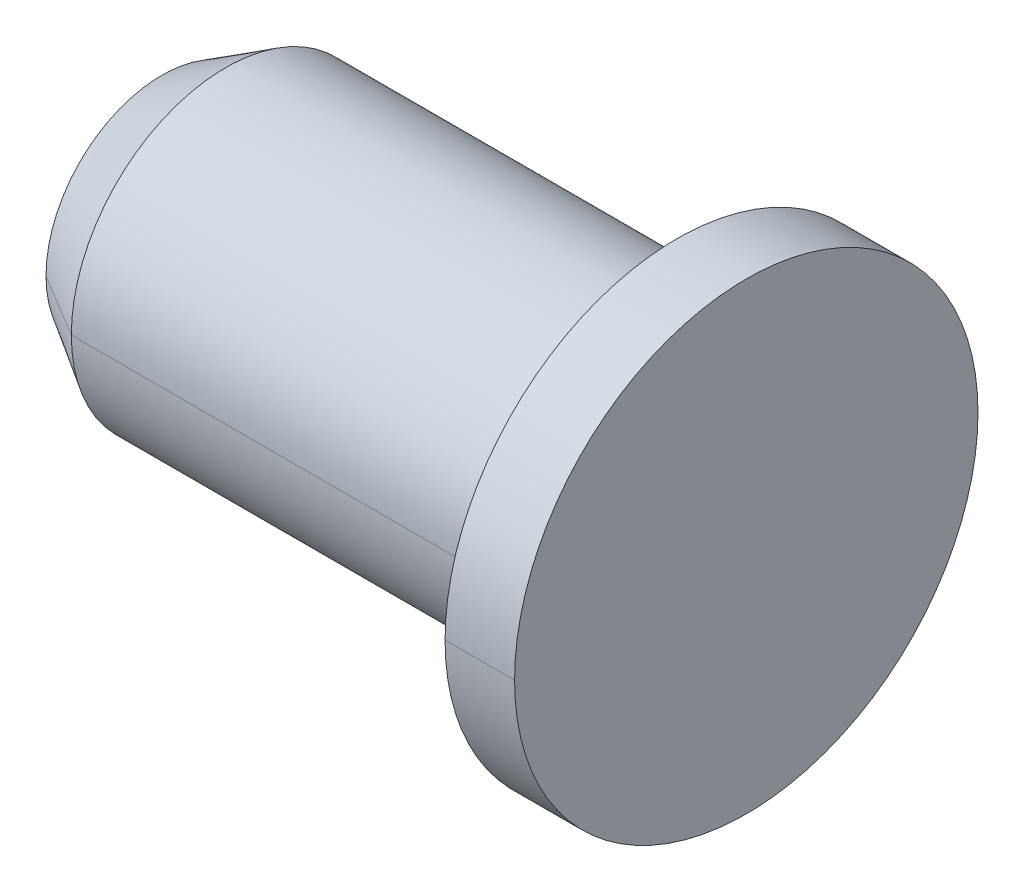
ISO-10303-21;
HEADER;
FILE_DESCRIPTION(('STEP AP214'),'2;1');
FILE_NAME('part.step','',(''),(''),'','','');
FILE_SCHEMA(('AUTOMOTIVE_DESIGN { 1 0 10303 214 1 1 1 1 }'));
ENDSEC;
DATA;
#1=APPLICATION_CONTEXT('core data for automotive mechanical design processes');
#2=APPLICATION_PROTOCOL_DEFINITION('international standard','automotive_design',2000,#1);
#3=PRODUCT_CONTEXT('',#1,'mechanical');
#4=PRODUCT('Part','Part','',(#3));
#5=PRODUCT_RELATED_PRODUCT_CATEGORY('part','',(#4));
#6=PRODUCT_DEFINITION_FORMATION('','',#4);
#7=PRODUCT_DEFINITION_CONTEXT('part definition',#1,'design');
#8=PRODUCT_DEFINITION('design','',#6,#7);
#9=PRODUCT_DEFINITION_SHAPE('','',#8);
#10=(LENGTH_UNIT() NAMED_UNIT(*) SI_UNIT(.MILLI.,.METRE.));
#11=(NAMED_UNIT(*) PLANE_ANGLE_UNIT() SI_UNIT($,.RADIAN.));
#12=(NAMED_UNIT(*) SI_UNIT($,.STERADIAN.) SOLID_ANGLE_UNIT());
#13=UNCERTAINTY_MEASURE_WITH_UNIT(LENGTH_MEASURE(1.E-05),#10,'distance_accuracy_value','');
#14=(GEOMETRIC_REPRESENTATION_CONTEXT(3) GLOBAL_UNCERTAINTY_ASSIGNED_CONTEXT((#13)) GLOBAL_UNIT_ASSIGNED_CONTEXT((#10,
#11,#12)) REPRESENTATION_CONTEXT('',''));
#15=CARTESIAN_POINT('',(0.,0.,0.));
#16=DIRECTION('',(0.,0.,1.));
#17=DIRECTION('',(1.,0.,0.));
#18=AXIS2_PLACEMENT_3D('',#15,#16,#17);
#19=CARTESIAN_POINT('',(-1.,0.,0.));
#20=DIRECTION('',(1.,0.,0.));
#21=DIRECTION('',(0.,0.,1.));
#22=AXIS2_PLACEMENT_3D('',#19,#20,#21);
#23=CYLINDRICAL_SURFACE('',#22,0.6);
#24=DIRECTION('',(1.,0.,0.));
#25=VECTOR('',#24,1.);
#26=CARTESIAN_POINT('',(-1.,0.,0.6));
#27=LINE('',#26,#25);
#28=CARTESIAN_POINT('',(-1.75172413793103,0.,0.6));
#29=VERTEX_POINT('',#28);
#30=CARTESIAN_POINT('',(0.,0.,0.6));
#31=VERTEX_POINT('',#30);
#32=EDGE_CURVE('E118',#29,#31,#27,.T.);
#33=ORIENTED_EDGE('',*,*,#32,.T.);
#34=CARTESIAN_POINT('',(0.,0.,0.));
#35=DIRECTION('',(1.,0.,0.));
#36=DIRECTION('',(0.,0.,1.));
#37=AXIS2_PLACEMENT_3D('',#34,#35,#36);
#38=CIRCLE('',#37,0.6);
#39=CARTESIAN_POINT('',(0.,0.,-0.6));
#40=VERTEX_POINT('',#39);
#41=EDGE_CURVE('E25',#40,#31,#38,.T.);
#42=ORIENTED_EDGE('',*,*,#41,.F.);
#43=DIRECTION('',(-1.,0.,0.));
#44=VECTOR('',#43,1.);
#45=CARTESIAN_POINT('',(-1.,0.,-0.6));
#46=LINE('',#45,#44);
#47=CARTESIAN_POINT('',(-1.75172413793103,0.,-0.6));
#48=VERTEX_POINT('',#47);
#49=EDGE_CURVE('E111',#40,#48,#46,.T.);
#50=ORIENTED_EDGE('',*,*,#49,.T.);
#51=CARTESIAN_POINT('',(-1.75172413793103,0.,0.));
#52=DIRECTION('',(1.,0.,0.));
#53=DIRECTION('',(0.,0.,1.));
#54=AXIS2_PLACEMENT_3D('',#51,#52,#53);
#55=CIRCLE('',#54,0.6);
#56=EDGE_CURVE('E102',#48,#29,#55,.T.);
#57=ORIENTED_EDGE('',*,*,#56,.T.);
#58=EDGE_LOOP('',(#33,#42,#50,#57));
#59=FACE_BOUND('',#58,.T.);
#60=ADVANCED_FACE('F15',(#59),#23,.T.);
#61=CARTESIAN_POINT('',(-2.,0.,0.3));
#62=DIRECTION('',(-1.,0.,0.));
#63=DIRECTION('',(0.,0.,1.));
#64=AXIS2_PLACEMENT_3D('',#61,#62,#63);
#65=PLANE('',#64);
#66=CARTESIAN_POINT('',(-2.,0.,0.));
#67=DIRECTION('',(1.,0.,0.));
#68=DIRECTION('',(0.,0.,-1.));
#69=AXIS2_PLACEMENT_3D('',#66,#67,#68);
#70=CIRCLE('',#69,0.18);
#71=CARTESIAN_POINT('',(-2.,0.,-0.18));
#72=VERTEX_POINT('',#71);
#73=CARTESIAN_POINT('',(-2.,0.,0.18));
#74=VERTEX_POINT('',#73);
#75=EDGE_CURVE('E39',#72,#74,#70,.T.);
#76=ORIENTED_EDGE('',*,*,#75,.T.);
#77=CARTESIAN_POINT('',(-2.,0.,0.));
#78=DIRECTION('',(1.,0.,0.));
#79=DIRECTION('',(0.,0.,-1.));
#80=AXIS2_PLACEMENT_3D('',#77,#78,#79);
#81=CIRCLE('',#80,0.18);
#82=EDGE_CURVE('E136',#74,#72,#81,.T.);
#83=ORIENTED_EDGE('',*,*,#82,.T.);
#84=EDGE_LOOP('',(#76,#83));
#85=FACE_BOUND('',#84,.T.);
#86=CARTESIAN_POINT('',(-2.,0.,0.));
#87=DIRECTION('',(-1.,0.,0.));
#88=DIRECTION('',(0.,0.,1.));
#89=AXIS2_PLACEMENT_3D('',#86,#87,#88);
#90=CIRCLE('',#89,0.45);
#91=CARTESIAN_POINT('',(-2.,0.,0.45));
#92=VERTEX_POINT('',#91);
#93=CARTESIAN_POINT('',(-2.,0.,-0.45));
#94=VERTEX_POINT('',#93);
#95=EDGE_CURVE('E101',#92,#94,#90,.T.);
#96=ORIENTED_EDGE('',*,*,#95,.T.);
#97=CARTESIAN_POINT('',(-2.,0.,0.));
#98=DIRECTION('',(-1.,0.,0.));
#99=DIRECTION('',(0.,0.,1.));
#100=AXIS2_PLACEMENT_3D('',#97,#98,#99);
#101=CIRCLE('',#100,0.45);
#102=EDGE_CURVE('E96',#94,#92,#101,.T.);
#103=ORIENTED_EDGE('',*,*,#102,.T.);
#104=EDGE_LOOP('',(#96,#103));
#105=FACE_BOUND('',#104,.T.);
#106=ADVANCED_FACE('F162',(#85,#105),#65,.T.);
#107=CARTESIAN_POINT('',(0.135,0.,0.));
#108=DIRECTION('',(-1.,0.,0.));
#109=DIRECTION('',(0.,0.,-1.));
#110=AXIS2_PLACEMENT_3D('',#107,#108,#109);
#111=CYLINDRICAL_SURFACE('',#110,0.9);
#112=DIRECTION('',(-1.,0.,0.));
#113=VECTOR('',#112,1.);
#114=CARTESIAN_POINT('',(0.135,0.,-0.9));
#115=LINE('',#114,#113);
#116=CARTESIAN_POINT('',(0.27,0.,-0.9));
#117=VERTEX_POINT('',#116);
#118=CARTESIAN_POINT('',(0.,0.,-0.9));
#119=VERTEX_POINT('',#118);
#120=EDGE_CURVE('E134',#117,#119,#115,.T.);
#121=ORIENTED_EDGE('',*,*,#120,.T.);
#122=CARTESIAN_POINT('',(0.,0.,0.));
#123=DIRECTION('',(-1.,0.,0.));
#124=DIRECTION('',(0.,0.,-1.));
#125=AXIS2_PLACEMENT_3D('',#122,#123,#124);
#126=CIRCLE('',#125,0.9);
#127=CARTESIAN_POINT('',(0.,0.,0.9));
#128=VERTEX_POINT('',#127);
#129=EDGE_CURVE('E140',#128,#119,#126,.T.);
#130=ORIENTED_EDGE('',*,*,#129,.F.);
#131=DIRECTION('',(1.,0.,0.));
#132=VECTOR('',#131,1.);
#133=CARTESIAN_POINT('',(0.135,0.,0.9));
#134=LINE('',#133,#132);
#135=CARTESIAN_POINT('',(0.27,0.,0.9));
#136=VERTEX_POINT('',#135);
#137=EDGE_CURVE('E127',#128,#136,#134,.T.);
#138=ORIENTED_EDGE('',*,*,#137,.T.);
#139=CARTESIAN_POINT('',(0.27,0.,0.));
#140=DIRECTION('',(-1.,0.,0.));
#141=DIRECTION('',(0.,0.,-1.));
#142=AXIS2_PLACEMENT_3D('',#139,#140,#141);
#143=CIRCLE('',#142,0.9);
#144=EDGE_CURVE('E10',#136,#117,#143,.T.);
#145=ORIENTED_EDGE('',*,*,#144,.T.);
#146=EDGE_LOOP('',(#121,#130,#138,#145));
#147=FACE_BOUND('',#146,.T.);
#148=ADVANCED_FACE('F164',(#147),#111,.T.);
#149=CARTESIAN_POINT('',(0.27,0.,-0.45));
#150=DIRECTION('',(1.,0.,0.));
#151=DIRECTION('',(0.,0.,1.));
#152=AXIS2_PLACEMENT_3D('',#149,#150,#151);
#153=PLANE('',#152);
#154=CARTESIAN_POINT('',(0.27,0.,0.));
#155=DIRECTION('',(-1.,0.,0.));
#156=DIRECTION('',(0.,0.,-1.));
#157=AXIS2_PLACEMENT_3D('',#154,#155,#156);
#158=CIRCLE('',#157,0.9);
#159=EDGE_CURVE('E131',#117,#136,#158,.T.);
#160=ORIENTED_EDGE('',*,*,#159,.F.);
#161=ORIENTED_EDGE('',*,*,#144,.F.);
#162=EDGE_LOOP('',(#160,#161));
#163=FACE_BOUND('',#162,.T.);
#164=ADVANCED_FACE('F172',(#163),#153,.T.);
#165=CARTESIAN_POINT('',(0.,0.,-0.45));
#166=DIRECTION('',(-1.,0.,0.));
#167=DIRECTION('',(0.,0.,1.));
#168=AXIS2_PLACEMENT_3D('',#165,#166,#167);
#169=PLANE('',#168);
#170=CARTESIAN_POINT('',(0.,0.,0.));
#171=DIRECTION('',(1.,0.,0.));
#172=DIRECTION('',(0.,0.,1.));
#173=AXIS2_PLACEMENT_3D('',#170,#171,#172);
#174=CIRCLE('',#173,0.6);
#175=EDGE_CURVE('E115',#31,#40,#174,.T.);
#176=ORIENTED_EDGE('',*,*,#175,.T.);
#177=ORIENTED_EDGE('',*,*,#41,.T.);
#178=EDGE_LOOP('',(#176,#177));
#179=FACE_BOUND('',#178,.T.);
#180=CARTESIAN_POINT('',(0.,0.,0.));
#181=DIRECTION('',(-1.,0.,0.));
#182=DIRECTION('',(0.,0.,-1.));
#183=AXIS2_PLACEMENT_3D('',#180,#181,#182);
#184=CIRCLE('',#183,0.9);
#185=EDGE_CURVE('E18',#119,#128,#184,.T.);
#186=ORIENTED_EDGE('',*,*,#185,.T.);
#187=ORIENTED_EDGE('',*,*,#129,.T.);
#188=EDGE_LOOP('',(#186,#187));
#189=FACE_BOUND('',#188,.T.);
#190=ADVANCED_FACE('F191',(#179,#189),#169,.T.);
#191=CARTESIAN_POINT('',(-1.87586206896552,0.,0.));
#192=DIRECTION('',(1.,0.,0.));
#193=DIRECTION('',(0.,0.,1.));
#194=AXIS2_PLACEMENT_3D('',#191,#192,#193);
#195=CONICAL_SURFACE('',#194,0.525,0.543477594713044);
#196=DIRECTION('',(-0.85591554194579,0.,-0.517115639925582));
#197=VECTOR('',#196,1.);
#198=CARTESIAN_POINT('',(-1.87586206896552,0.,0.525));
#199=LINE('',#198,#197);
#200=EDGE_CURVE('E107',#29,#92,#199,.T.);
#201=ORIENTED_EDGE('',*,*,#200,.T.);
#202=ORIENTED_EDGE('',*,*,#102,.F.);
#203=DIRECTION('',(0.85591554194579,0.,-0.517115639925582));
#204=VECTOR('',#203,1.);
#205=CARTESIAN_POINT('',(-1.87586206896552,0.,-0.525));
#206=LINE('',#205,#204);
#207=EDGE_CURVE('E89',#94,#48,#206,.T.);
#208=ORIENTED_EDGE('',*,*,#207,.T.);
#209=CARTESIAN_POINT('',(-1.75172413793103,0.,0.));
#210=DIRECTION('',(1.,0.,0.));
#211=DIRECTION('',(0.,0.,1.));
#212=AXIS2_PLACEMENT_3D('',#209,#210,#211);
#213=CIRCLE('',#212,0.6);
#214=EDGE_CURVE('E94',#29,#48,#213,.T.);
#215=ORIENTED_EDGE('',*,*,#214,.F.);
#216=EDGE_LOOP('',(#201,#202,#208,#215));
#217=FACE_BOUND('',#216,.T.);
#218=ADVANCED_FACE('F92',(#217),#195,.T.);
#219=CARTESIAN_POINT('',(-1.94803847577293,0.,0.));
#220=DIRECTION('',(-1.,0.,0.));
#221=DIRECTION('',(0.,0.,-1.));
#222=AXIS2_PLACEMENT_3D('',#219,#220,#221);
#223=CONICAL_SURFACE('',#222,0.09,1.0471975511966);
#224=DIRECTION('',(-0.5,0.,0.866025403784439));
#225=VECTOR('',#224,1.);
#226=CARTESIAN_POINT('',(-1.94803847577293,0.,0.09));
#227=LINE('',#226,#225);
#228=CARTESIAN_POINT('',(-1.89607695154587,0.,0.));
#229=VERTEX_POINT('',#228);
#230=EDGE_CURVE('E144',#229,#74,#227,.T.);
#231=ORIENTED_EDGE('',*,*,#230,.T.);
#232=ORIENTED_EDGE('',*,*,#75,.F.);
#233=DIRECTION('',(0.5,0.,0.866025403784439));
#234=VECTOR('',#233,1.);
#235=CARTESIAN_POINT('',(-1.94803847577293,0.,-0.09));
#236=LINE('',#235,#234);
#237=EDGE_CURVE('E141',#72,#229,#236,.T.);
#238=ORIENTED_EDGE('',*,*,#237,.T.);
#239=EDGE_LOOP('',(#231,#232,#238));
#240=FACE_BOUND('',#239,.T.);
#241=ADVANCED_FACE('F177',(#240),#223,.F.);
#242=CARTESIAN_POINT('',(-1.94803847577293,0.,0.));
#243=DIRECTION('',(-1.,0.,0.));
#244=DIRECTION('',(0.,0.,-1.));
#245=AXIS2_PLACEMENT_3D('',#242,#243,#244);
#246=CONICAL_SURFACE('',#245,0.09,1.0471975511966);
#247=ORIENTED_EDGE('',*,*,#230,.F.);
#248=ORIENTED_EDGE('',*,*,#237,.F.);
#249=ORIENTED_EDGE('',*,*,#82,.F.);
#250=EDGE_LOOP('',(#247,#248,#249));
#251=FACE_BOUND('',#250,.T.);
#252=ADVANCED_FACE('F179',(#251),#246,.F.);
#253=CARTESIAN_POINT('',(-1.87586206896552,0.,0.));
#254=DIRECTION('',(1.,0.,0.));
#255=DIRECTION('',(0.,0.,1.));
#256=AXIS2_PLACEMENT_3D('',#253,#254,#255);
#257=CONICAL_SURFACE('',#256,0.525,0.543477594713044);
#258=ORIENTED_EDGE('',*,*,#200,.F.);
#259=ORIENTED_EDGE('',*,*,#56,.F.);
#260=ORIENTED_EDGE('',*,*,#207,.F.);
#261=ORIENTED_EDGE('',*,*,#95,.F.);
#262=EDGE_LOOP('',(#258,#259,#260,#261));
#263=FACE_BOUND('',#262,.T.);
#264=ADVANCED_FACE('F106',(#263),#257,.T.);
#265=CARTESIAN_POINT('',(0.135,0.,0.));
#266=DIRECTION('',(-1.,0.,0.));
#267=DIRECTION('',(0.,0.,-1.));
#268=AXIS2_PLACEMENT_3D('',#265,#266,#267);
#269=CYLINDRICAL_SURFACE('',#268,0.9);
#270=ORIENTED_EDGE('',*,*,#120,.F.);
#271=ORIENTED_EDGE('',*,*,#159,.T.);
#272=ORIENTED_EDGE('',*,*,#137,.F.);
#273=ORIENTED_EDGE('',*,*,#185,.F.);
#274=EDGE_LOOP('',(#270,#271,#272,#273));
#275=FACE_BOUND('',#274,.T.);
#276=ADVANCED_FACE('F185',(#275),#269,.T.);
#277=CARTESIAN_POINT('',(-1.,0.,0.));
#278=DIRECTION('',(1.,0.,0.));
#279=DIRECTION('',(0.,0.,1.));
#280=AXIS2_PLACEMENT_3D('',#277,#278,#279);
#281=CYLINDRICAL_SURFACE('',#280,0.6);
#282=ORIENTED_EDGE('',*,*,#32,.F.);
#283=ORIENTED_EDGE('',*,*,#214,.T.);
#284=ORIENTED_EDGE('',*,*,#49,.F.);
#285=ORIENTED_EDGE('',*,*,#175,.F.);
#286=EDGE_LOOP('',(#282,#283,#284,#285));
#287=FACE_BOUND('',#286,.T.);
#288=ADVANCED_FACE('F117',(#287),#281,.T.);
#289=CLOSED_SHELL('',(#60,#106,#148,#164,#190,#218,#241,#252,#264,#276,#288));
#290=MANIFOLD_SOLID_BREP('B1',#289);
#291=ADVANCED_BREP_SHAPE_REPRESENTATION('',(#18,#290),#14);
#292=SHAPE_DEFINITION_REPRESENTATION(#9,#291);
ENDSEC;
END-ISO-10303-21;
